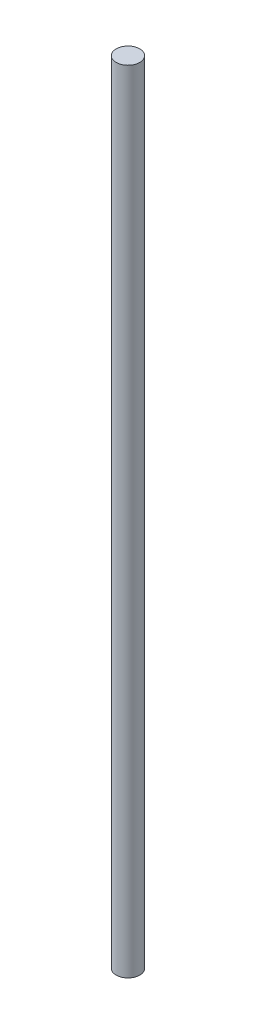
ISO-10303-21;
HEADER;
FILE_DESCRIPTION(('STEP AP214'),'2;1');
FILE_NAME('part.step','',(''),(''),'','','');
FILE_SCHEMA(('AUTOMOTIVE_DESIGN { 1 0 10303 214 1 1 1 1 }'));
ENDSEC;
DATA;
#1=APPLICATION_CONTEXT('core data for automotive mechanical design processes');
#2=APPLICATION_PROTOCOL_DEFINITION('international standard','automotive_design',2000,#1);
#3=PRODUCT_CONTEXT('',#1,'mechanical');
#4=PRODUCT('Part','Part','',(#3));
#5=PRODUCT_RELATED_PRODUCT_CATEGORY('part','',(#4));
#6=PRODUCT_DEFINITION_FORMATION('','',#4);
#7=PRODUCT_DEFINITION_CONTEXT('part definition',#1,'design');
#8=PRODUCT_DEFINITION('design','',#6,#7);
#9=PRODUCT_DEFINITION_SHAPE('','',#8);
#10=(LENGTH_UNIT() NAMED_UNIT(*) SI_UNIT(.MILLI.,.METRE.));
#11=(NAMED_UNIT(*) PLANE_ANGLE_UNIT() SI_UNIT($,.RADIAN.));
#12=(NAMED_UNIT(*) SI_UNIT($,.STERADIAN.) SOLID_ANGLE_UNIT());
#13=UNCERTAINTY_MEASURE_WITH_UNIT(LENGTH_MEASURE(1.E-05),#10,'distance_accuracy_value','');
#14=(GEOMETRIC_REPRESENTATION_CONTEXT(3) GLOBAL_UNCERTAINTY_ASSIGNED_CONTEXT((#13)) GLOBAL_UNIT_ASSIGNED_CONTEXT((#10,
#11,#12)) REPRESENTATION_CONTEXT('',''));
#15=CARTESIAN_POINT('',(0.,0.,0.));
#16=DIRECTION('',(0.,0.,1.));
#17=DIRECTION('',(1.,0.,0.));
#18=AXIS2_PLACEMENT_3D('',#15,#16,#17);
#19=CARTESIAN_POINT('',(0.,67.,0.));
#20=DIRECTION('',(0.,-1.,0.));
#21=DIRECTION('',(0.,0.,-1.));
#22=AXIS2_PLACEMENT_3D('',#19,#20,#21);
#23=CYLINDRICAL_SURFACE('',#22,1.);
#24=CARTESIAN_POINT('',(0.,67.,0.));
#25=DIRECTION('',(0.,1.,0.));
#26=DIRECTION('',(0.,0.,1.));
#27=AXIS2_PLACEMENT_3D('',#24,#25,#26);
#28=CIRCLE('',#27,1.);
#29=CARTESIAN_POINT('',(0.,67.,1.));
#30=VERTEX_POINT('',#29);
#31=EDGE_CURVE('E10',#30,#30,#28,.T.);
#32=ORIENTED_EDGE('',*,*,#31,.F.);
#33=EDGE_LOOP('',(#32));
#34=FACE_BOUND('',#33,.T.);
#35=CARTESIAN_POINT('',(0.,0.,0.));
#36=DIRECTION('',(0.,1.,0.));
#37=DIRECTION('',(0.,0.,1.));
#38=AXIS2_PLACEMENT_3D('',#35,#36,#37);
#39=CIRCLE('',#38,1.);
#40=CARTESIAN_POINT('',(0.,0.,1.));
#41=VERTEX_POINT('',#40);
#42=EDGE_CURVE('E40',#41,#41,#39,.T.);
#43=ORIENTED_EDGE('',*,*,#42,.T.);
#44=EDGE_LOOP('',(#43));
#45=FACE_BOUND('',#44,.T.);
#46=ADVANCED_FACE('F37',(#34,#45),#23,.T.);
#47=CARTESIAN_POINT('',(0.,67.,0.));
#48=DIRECTION('',(0.,1.,0.));
#49=DIRECTION('',(0.,0.,1.));
#50=AXIS2_PLACEMENT_3D('',#47,#48,#49);
#51=PLANE('',#50);
#52=ORIENTED_EDGE('',*,*,#31,.T.);
#53=EDGE_LOOP('',(#52));
#54=FACE_BOUND('',#53,.T.);
#55=ADVANCED_FACE('F52',(#54),#51,.T.);
#56=CARTESIAN_POINT('',(0.,0.,0.));
#57=DIRECTION('',(0.,1.,0.));
#58=DIRECTION('',(0.,0.,1.));
#59=AXIS2_PLACEMENT_3D('',#56,#57,#58);
#60=PLANE('',#59);
#61=ORIENTED_EDGE('',*,*,#42,.F.);
#62=EDGE_LOOP('',(#61));
#63=FACE_BOUND('',#62,.T.);
#64=ADVANCED_FACE('F50',(#63),#60,.F.);
#65=CLOSED_SHELL('',(#46,#55,#64));
#66=MANIFOLD_SOLID_BREP('B2',#65);
#67=ADVANCED_BREP_SHAPE_REPRESENTATION('',(#18,#66),#14);
#68=SHAPE_DEFINITION_REPRESENTATION(#9,#67);
ENDSEC;
END-ISO-10303-21;
